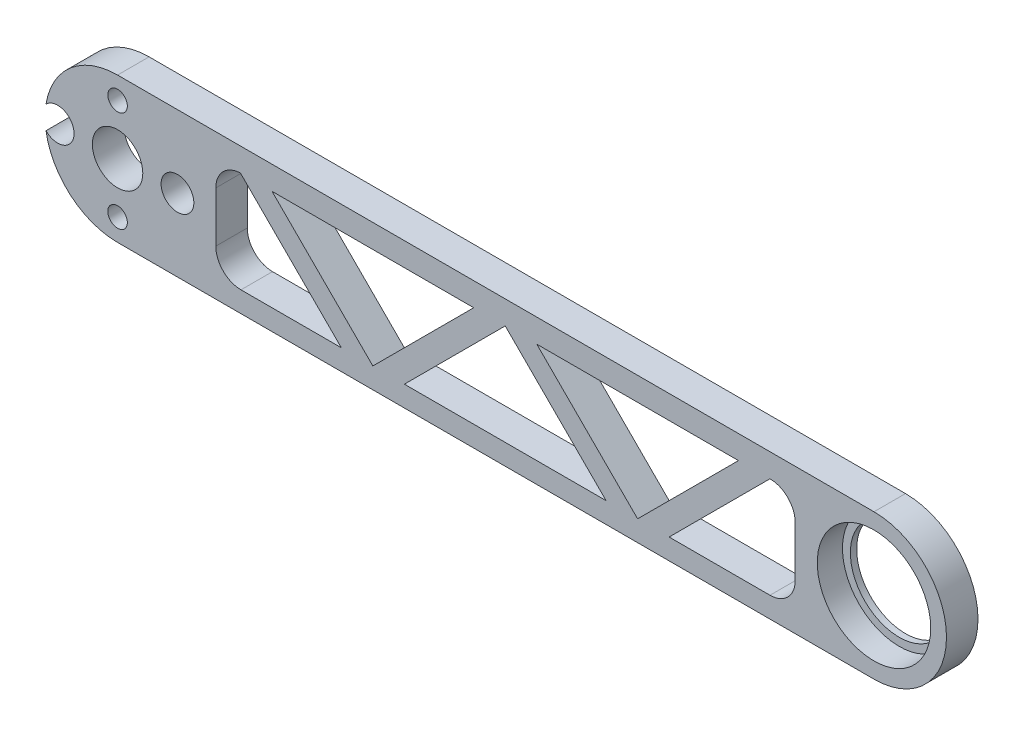
ISO-10303-21;
HEADER;
FILE_DESCRIPTION(('STEP AP214'),'2;1');
FILE_NAME('part.step','',(''),(''),'','','');
FILE_SCHEMA(('AUTOMOTIVE_DESIGN { 1 0 10303 214 1 1 1 1 }'));
ENDSEC;
DATA;
#1=APPLICATION_CONTEXT('core data for automotive mechanical design processes');
#2=APPLICATION_PROTOCOL_DEFINITION('international standard','automotive_design',2000,#1);
#3=PRODUCT_CONTEXT('',#1,'mechanical');
#4=PRODUCT('Part','Part','',(#3));
#5=PRODUCT_RELATED_PRODUCT_CATEGORY('part','',(#4));
#6=PRODUCT_DEFINITION_FORMATION('','',#4);
#7=PRODUCT_DEFINITION_CONTEXT('part definition',#1,'design');
#8=PRODUCT_DEFINITION('design','',#6,#7);
#9=PRODUCT_DEFINITION_SHAPE('','',#8);
#10=(LENGTH_UNIT() NAMED_UNIT(*) SI_UNIT(.MILLI.,.METRE.));
#11=(NAMED_UNIT(*) PLANE_ANGLE_UNIT() SI_UNIT($,.RADIAN.));
#12=(NAMED_UNIT(*) SI_UNIT($,.STERADIAN.) SOLID_ANGLE_UNIT());
#13=UNCERTAINTY_MEASURE_WITH_UNIT(LENGTH_MEASURE(1.E-05),#10,'distance_accuracy_value','');
#14=(GEOMETRIC_REPRESENTATION_CONTEXT(3) GLOBAL_UNCERTAINTY_ASSIGNED_CONTEXT((#13)) GLOBAL_UNIT_ASSIGNED_CONTEXT((#10,
#11,#12)) REPRESENTATION_CONTEXT('',''));
#15=CARTESIAN_POINT('',(0.,0.,0.));
#16=DIRECTION('',(0.,0.,1.));
#17=DIRECTION('',(1.,0.,0.));
#18=AXIS2_PLACEMENT_3D('',#15,#16,#17);
#19=CARTESIAN_POINT('',(0.,-8.22026085575622,-15.));
#20=DIRECTION('',(0.,1.,0.));
#21=DIRECTION('',(-1.,0.,0.));
#22=AXIS2_PLACEMENT_3D('',#19,#20,#21);
#23=PLANE('',#22);
#24=DIRECTION('',(-1.,0.,0.));
#25=VECTOR('',#24,1.);
#26=CARTESIAN_POINT('',(0.,-8.22026085575622,-5.));
#27=LINE('',#26,#25);
#28=CARTESIAN_POINT('',(103.5,-8.22026085575621,-5.));
#29=VERTEX_POINT('',#28);
#30=CARTESIAN_POINT('',(87.5,-8.22026085575621,-5.));
#31=VERTEX_POINT('',#30);
#32=EDGE_CURVE('E104',#29,#31,#27,.T.);
#33=ORIENTED_EDGE('',*,*,#32,.T.);
#34=DIRECTION('',(0.,0.,1.));
#35=VECTOR('',#34,1.);
#36=CARTESIAN_POINT('',(87.5,-8.22026085575621,-5.));
#37=LINE('',#36,#35);
#38=CARTESIAN_POINT('',(87.5,-8.22026085575621,0.));
#39=VERTEX_POINT('',#38);
#40=EDGE_CURVE('E109',#31,#39,#37,.T.);
#41=ORIENTED_EDGE('',*,*,#40,.T.);
#42=DIRECTION('',(-1.,0.,0.));
#43=VECTOR('',#42,1.);
#44=CARTESIAN_POINT('',(0.,-8.22026085575622,0.));
#45=LINE('',#44,#43);
#46=CARTESIAN_POINT('',(103.5,-8.22026085575621,0.));
#47=VERTEX_POINT('',#46);
#48=EDGE_CURVE('E375',#47,#39,#45,.T.);
#49=ORIENTED_EDGE('',*,*,#48,.F.);
#50=DIRECTION('',(0.,0.,1.));
#51=VECTOR('',#50,1.);
#52=CARTESIAN_POINT('',(103.5,-8.22026085575621,-15.));
#53=LINE('',#52,#51);
#54=EDGE_CURVE('E387',#29,#47,#53,.T.);
#55=ORIENTED_EDGE('',*,*,#54,.F.);
#56=EDGE_LOOP('',(#33,#41,#49,#55));
#57=FACE_BOUND('',#56,.T.);
#58=ADVANCED_FACE('F87',(#57),#23,.T.);
#59=CARTESIAN_POINT('',(77.5,-8.22026085575621,0.));
#60=VERTEX_POINT('',#59);
#61=CARTESIAN_POINT('',(45.5,-8.22026085575622,0.));
#62=VERTEX_POINT('',#61);
#63=EDGE_CURVE('E374',#60,#62,#45,.T.);
#64=ORIENTED_EDGE('',*,*,#63,.F.);
#65=DIRECTION('',(0.,0.,1.));
#66=VECTOR('',#65,1.);
#67=CARTESIAN_POINT('',(77.5,-8.22026085575621,-5.));
#68=LINE('',#67,#66);
#69=CARTESIAN_POINT('',(77.5,-8.22026085575621,-5.));
#70=VERTEX_POINT('',#69);
#71=EDGE_CURVE('E277',#70,#60,#68,.T.);
#72=ORIENTED_EDGE('',*,*,#71,.F.);
#73=CARTESIAN_POINT('',(45.5,-8.22026085575622,-5.));
#74=VERTEX_POINT('',#73);
#75=EDGE_CURVE('E395',#70,#74,#27,.T.);
#76=ORIENTED_EDGE('',*,*,#75,.T.);
#77=DIRECTION('',(0.,0.,1.));
#78=VECTOR('',#77,1.);
#79=CARTESIAN_POINT('',(45.5,-8.22026085575622,-10.));
#80=LINE('',#79,#78);
#81=EDGE_CURVE('E314',#74,#62,#80,.T.);
#82=ORIENTED_EDGE('',*,*,#81,.T.);
#83=EDGE_LOOP('',(#64,#72,#76,#82));
#84=FACE_BOUND('',#83,.T.);
#85=ADVANCED_FACE('F497',(#84),#23,.T.);
#86=CARTESIAN_POINT('',(0.,-8.,-15.));
#87=DIRECTION('',(0.,0.,1.));
#88=DIRECTION('',(1.,0.,0.));
#89=AXIS2_PLACEMENT_3D('',#86,#87,#88);
#90=CYLINDRICAL_SURFACE('',#89,1.55);
#91=CARTESIAN_POINT('',(0.,-8.,0.));
#92=DIRECTION('',(0.,0.,1.));
#93=DIRECTION('',(1.,0.,0.));
#94=AXIS2_PLACEMENT_3D('',#91,#92,#93);
#95=CIRCLE('',#94,1.55);
#96=CARTESIAN_POINT('',(1.55,-8.,0.));
#97=VERTEX_POINT('',#96);
#98=EDGE_CURVE('E429',#97,#97,#95,.T.);
#99=ORIENTED_EDGE('',*,*,#98,.T.);
#100=EDGE_LOOP('',(#99));
#101=FACE_BOUND('',#100,.T.);
#102=CARTESIAN_POINT('',(0.,-8.,-2.2));
#103=DIRECTION('',(0.,0.,-1.));
#104=DIRECTION('',(-1.,0.,0.));
#105=AXIS2_PLACEMENT_3D('',#102,#103,#104);
#106=CIRCLE('',#105,1.55);
#107=CARTESIAN_POINT('',(-1.55,-8.,-2.2));
#108=VERTEX_POINT('',#107);
#109=EDGE_CURVE('E91',#108,#108,#106,.F.);
#110=ORIENTED_EDGE('',*,*,#109,.F.);
#111=EDGE_LOOP('',(#110));
#112=FACE_BOUND('',#111,.T.);
#113=ADVANCED_FACE('F494',(#101,#112),#90,.F.);
#114=CARTESIAN_POINT('',(0.,8.,-15.));
#115=DIRECTION('',(0.,0.,1.));
#116=DIRECTION('',(1.,0.,0.));
#117=AXIS2_PLACEMENT_3D('',#114,#115,#116);
#118=CYLINDRICAL_SURFACE('',#117,1.55);
#119=CARTESIAN_POINT('',(0.,8.,0.));
#120=DIRECTION('',(0.,0.,1.));
#121=DIRECTION('',(1.,0.,0.));
#122=AXIS2_PLACEMENT_3D('',#119,#120,#121);
#123=CIRCLE('',#122,1.55);
#124=CARTESIAN_POINT('',(1.55,8.,0.));
#125=VERTEX_POINT('',#124);
#126=EDGE_CURVE('E430',#125,#125,#123,.T.);
#127=ORIENTED_EDGE('',*,*,#126,.T.);
#128=EDGE_LOOP('',(#127));
#129=FACE_BOUND('',#128,.T.);
#130=CARTESIAN_POINT('',(0.,8.,-2.2));
#131=DIRECTION('',(0.,0.,-1.));
#132=DIRECTION('',(-1.,0.,0.));
#133=AXIS2_PLACEMENT_3D('',#130,#131,#132);
#134=CIRCLE('',#133,1.55);
#135=CARTESIAN_POINT('',(-1.55,8.,-2.2));
#136=VERTEX_POINT('',#135);
#137=EDGE_CURVE('E302',#136,#136,#134,.F.);
#138=ORIENTED_EDGE('',*,*,#137,.F.);
#139=EDGE_LOOP('',(#138));
#140=FACE_BOUND('',#139,.T.);
#141=ADVANCED_FACE('F496',(#129,#140),#118,.F.);
#142=CARTESIAN_POINT('',(0.,0.,-5.));
#143=DIRECTION('',(0.,0.,1.));
#144=DIRECTION('',(1.,0.,0.));
#145=AXIS2_PLACEMENT_3D('',#142,#143,#144);
#146=PLANE('',#145);
#147=DIRECTION('',(-0.707106781186548,0.707106781186547,0.));
#148=VECTOR('',#147,1.);
#149=CARTESIAN_POINT('',(37.1398695721219,37.1398695721219,-5.));
#150=LINE('',#149,#148);
#151=CARTESIAN_POINT('',(82.5,-8.22026085575621,-5.));
#152=VERTEX_POINT('',#151);
#153=CARTESIAN_POINT('',(66.5,7.77973914424379,-5.));
#154=VERTEX_POINT('',#153);
#155=EDGE_CURVE('E293',#152,#154,#150,.T.);
#156=ORIENTED_EDGE('',*,*,#155,.F.);
#157=DIRECTION('',(-0.707106781186548,-0.707106781186548,0.));
#158=VECTOR('',#157,1.);
#159=CARTESIAN_POINT('',(45.3601304278781,-45.3601304278781,-5.));
#160=LINE('',#159,#158);
#161=CARTESIAN_POINT('',(98.5,7.77973914424379,-5.));
#162=VERTEX_POINT('',#161);
#163=EDGE_CURVE('E276',#162,#152,#160,.T.);
#164=ORIENTED_EDGE('',*,*,#163,.F.);
#165=DIRECTION('',(-1.,0.,0.));
#166=VECTOR('',#165,1.);
#167=CARTESIAN_POINT('',(0.,7.77973914424378,-5.));
#168=LINE('',#167,#166);
#169=EDGE_CURVE('E362',#162,#154,#168,.T.);
#170=ORIENTED_EDGE('',*,*,#169,.T.);
#171=EDGE_LOOP('',(#156,#164,#170));
#172=FACE_BOUND('',#171,.T.);
#173=ORIENTED_EDGE('',*,*,#75,.F.);
#174=DIRECTION('',(-0.707106781186548,0.707106781186548,0.));
#175=VECTOR('',#174,1.);
#176=CARTESIAN_POINT('',(34.6398695721219,34.6398695721219,-5.));
#177=LINE('',#176,#175);
#178=CARTESIAN_POINT('',(61.5,7.77973914424378,-5.));
#179=VERTEX_POINT('',#178);
#180=EDGE_CURVE('E266',#70,#179,#177,.T.);
#181=ORIENTED_EDGE('',*,*,#180,.T.);
#182=DIRECTION('',(-0.707106781186548,-0.707106781186548,0.));
#183=VECTOR('',#182,1.);
#184=CARTESIAN_POINT('',(26.8601304278781,-26.8601304278781,-5.));
#185=LINE('',#184,#183);
#186=EDGE_CURVE('E329',#179,#74,#185,.T.);
#187=ORIENTED_EDGE('',*,*,#186,.T.);
#188=EDGE_LOOP('',(#173,#181,#187));
#189=FACE_BOUND('',#188,.T.);
#190=CARTESIAN_POINT('',(0.,8.,-5.));
#191=DIRECTION('',(0.,0.,-1.));
#192=DIRECTION('',(-1.,0.,0.));
#193=AXIS2_PLACEMENT_3D('',#190,#191,#192);
#194=CIRCLE('',#193,2.75);
#195=CARTESIAN_POINT('',(-2.75,8.,-5.));
#196=VERTEX_POINT('',#195);
#197=EDGE_CURVE('E303',#196,#196,#194,.T.);
#198=ORIENTED_EDGE('',*,*,#197,.F.);
#199=EDGE_LOOP('',(#198));
#200=FACE_BOUND('',#199,.T.);
#201=CARTESIAN_POINT('',(0.,-8.,-5.));
#202=DIRECTION('',(0.,0.,-1.));
#203=DIRECTION('',(-1.,0.,0.));
#204=AXIS2_PLACEMENT_3D('',#201,#202,#203);
#205=CIRCLE('',#204,2.75);
#206=CARTESIAN_POINT('',(-2.75,-8.,-5.));
#207=VERTEX_POINT('',#206);
#208=EDGE_CURVE('E306',#207,#207,#205,.T.);
#209=ORIENTED_EDGE('',*,*,#208,.F.);
#210=EDGE_LOOP('',(#209));
#211=FACE_BOUND('',#210,.T.);
#212=DIRECTION('',(-0.707106781186548,0.707106781186547,0.));
#213=VECTOR('',#212,1.);
#214=CARTESIAN_POINT('',(16.1398695721219,16.1398695721219,-5.));
#215=LINE('',#214,#213);
#216=CARTESIAN_POINT('',(40.5,-8.22026085575622,-5.));
#217=VERTEX_POINT('',#216);
#218=CARTESIAN_POINT('',(24.5,7.77973914424378,-5.));
#219=VERTEX_POINT('',#218);
#220=EDGE_CURVE('E341',#217,#219,#215,.T.);
#221=ORIENTED_EDGE('',*,*,#220,.F.);
#222=DIRECTION('',(-0.707106781186548,-0.707106781186548,0.));
#223=VECTOR('',#222,1.);
#224=CARTESIAN_POINT('',(24.3601304278781,-24.3601304278781,-5.));
#225=LINE('',#224,#223);
#226=CARTESIAN_POINT('',(56.5,7.77973914424379,-5.));
#227=VERTEX_POINT('',#226);
#228=EDGE_CURVE('E336',#227,#217,#225,.T.);
#229=ORIENTED_EDGE('',*,*,#228,.F.);
#230=DIRECTION('',(-1.,0.,0.));
#231=VECTOR('',#230,1.);
#232=CARTESIAN_POINT('',(0.,7.77973914424378,-5.));
#233=LINE('',#232,#231);
#234=EDGE_CURVE('E338',#227,#219,#233,.T.);
#235=ORIENTED_EDGE('',*,*,#234,.T.);
#236=EDGE_LOOP('',(#221,#229,#235));
#237=FACE_BOUND('',#236,.T.);
#238=DIRECTION('',(-1.,0.,0.));
#239=VECTOR('',#238,1.);
#240=CARTESIAN_POINT('',(0.,-8.22026085575622,-5.));
#241=LINE('',#240,#239);
#242=CARTESIAN_POINT('',(35.5,-8.22026085575622,-5.));
#243=VERTEX_POINT('',#242);
#244=CARTESIAN_POINT('',(19.5780633118678,-8.22026085575622,-5.));
#245=VERTEX_POINT('',#244);
#246=EDGE_CURVE('E411',#243,#245,#241,.T.);
#247=ORIENTED_EDGE('',*,*,#246,.F.);
#248=DIRECTION('',(-0.707106781186548,0.707106781186547,0.));
#249=VECTOR('',#248,1.);
#250=CARTESIAN_POINT('',(13.6398695721219,13.6398695721219,-5.));
#251=LINE('',#250,#249);
#252=CARTESIAN_POINT('',(19.5,7.77973914424378,-5.));
#253=VERTEX_POINT('',#252);
#254=EDGE_CURVE('E413',#243,#253,#251,.T.);
#255=ORIENTED_EDGE('',*,*,#254,.T.);
#256=CARTESIAN_POINT('',(19.5780633118678,3.78050095187011,-5.));
#257=DIRECTION('',(0.,0.,1.));
#258=DIRECTION('',(1.,0.,0.));
#259=AXIS2_PLACEMENT_3D('',#256,#257,#258);
#260=CIRCLE('',#259,4.);
#261=CARTESIAN_POINT('',(15.5780633118678,3.78050095187011,-5.));
#262=VERTEX_POINT('',#261);
#263=EDGE_CURVE('E403',#253,#262,#260,.T.);
#264=ORIENTED_EDGE('',*,*,#263,.T.);
#265=DIRECTION('',(0.,-1.,0.));
#266=VECTOR('',#265,1.);
#267=CARTESIAN_POINT('',(15.5780633118678,0.,-5.));
#268=LINE('',#267,#266);
#269=CARTESIAN_POINT('',(15.5780633118678,-4.22026085575622,-5.));
#270=VERTEX_POINT('',#269);
#271=EDGE_CURVE('E406',#262,#270,#268,.T.);
#272=ORIENTED_EDGE('',*,*,#271,.T.);
#273=CARTESIAN_POINT('',(19.5780633118678,-4.22026085575622,-5.));
#274=DIRECTION('',(0.,0.,1.));
#275=DIRECTION('',(1.,0.,0.));
#276=AXIS2_PLACEMENT_3D('',#273,#274,#275);
#277=CIRCLE('',#276,4.);
#278=EDGE_CURVE('E409',#245,#270,#277,.F.);
#279=ORIENTED_EDGE('',*,*,#278,.F.);
#280=EDGE_LOOP('',(#247,#255,#264,#272,#279));
#281=FACE_BOUND('',#280,.T.);
#282=CARTESIAN_POINT('',(0.,0.,-5.));
#283=DIRECTION('',(0.,0.,1.));
#284=DIRECTION('',(1.,0.,0.));
#285=AXIS2_PLACEMENT_3D('',#282,#283,#284);
#286=CIRCLE('',#285,11.5);
#287=CARTESIAN_POINT('',(-11.3547368421053,-1.82207333731038,-5.));
#288=VERTEX_POINT('',#287);
#289=CARTESIAN_POINT('',(0.,-11.5,-5.));
#290=VERTEX_POINT('',#289);
#291=EDGE_CURVE('E456',#288,#290,#286,.T.);
#292=ORIENTED_EDGE('',*,*,#291,.F.);
#293=CARTESIAN_POINT('',(-9.5,0.,-5.));
#294=DIRECTION('',(0.,0.,1.));
#295=DIRECTION('',(1.,0.,0.));
#296=AXIS2_PLACEMENT_3D('',#293,#294,#295);
#297=CIRCLE('',#296,2.6);
#298=CARTESIAN_POINT('',(-11.3547368421053,1.82207333731038,-5.));
#299=VERTEX_POINT('',#298);
#300=EDGE_CURVE('E422',#288,#299,#297,.T.);
#301=ORIENTED_EDGE('',*,*,#300,.T.);
#302=CARTESIAN_POINT('',(0.,11.5,-5.));
#303=VERTEX_POINT('',#302);
#304=EDGE_CURVE('E452',#303,#299,#286,.T.);
#305=ORIENTED_EDGE('',*,*,#304,.F.);
#306=DIRECTION('',(-1.,0.,0.));
#307=VECTOR('',#306,1.);
#308=CARTESIAN_POINT('',(0.,11.5,-5.));
#309=LINE('',#308,#307);
#310=CARTESIAN_POINT('',(120.,11.5,-5.));
#311=VERTEX_POINT('',#310);
#312=EDGE_CURVE('E462',#311,#303,#309,.T.);
#313=ORIENTED_EDGE('',*,*,#312,.F.);
#314=CARTESIAN_POINT('',(120.,0.,-5.));
#315=DIRECTION('',(0.,0.,1.));
#316=DIRECTION('',(1.,0.,0.));
#317=AXIS2_PLACEMENT_3D('',#314,#315,#316);
#318=CIRCLE('',#317,11.5);
#319=CARTESIAN_POINT('',(120.,-11.5,-5.));
#320=VERTEX_POINT('',#319);
#321=EDGE_CURVE('E459',#320,#311,#318,.T.);
#322=ORIENTED_EDGE('',*,*,#321,.F.);
#323=DIRECTION('',(1.,0.,0.));
#324=VECTOR('',#323,1.);
#325=CARTESIAN_POINT('',(0.,-11.5,-5.));
#326=LINE('',#325,#324);
#327=EDGE_CURVE('E455',#290,#320,#326,.T.);
#328=ORIENTED_EDGE('',*,*,#327,.F.);
#329=EDGE_LOOP('',(#292,#301,#305,#313,#322,#328));
#330=FACE_BOUND('',#329,.T.);
#331=CARTESIAN_POINT('',(120.,0.,-5.));
#332=DIRECTION('',(0.,0.,1.));
#333=DIRECTION('',(1.,0.,0.));
#334=AXIS2_PLACEMENT_3D('',#331,#332,#333);
#335=CIRCLE('',#334,7.75);
#336=CARTESIAN_POINT('',(127.75,0.,-5.));
#337=VERTEX_POINT('',#336);
#338=EDGE_CURVE('E442',#337,#337,#335,.T.);
#339=ORIENTED_EDGE('',*,*,#338,.T.);
#340=EDGE_LOOP('',(#339));
#341=FACE_BOUND('',#340,.T.);
#342=CARTESIAN_POINT('',(0.,0.,-5.));
#343=DIRECTION('',(0.,0.,1.));
#344=DIRECTION('',(1.,0.,0.));
#345=AXIS2_PLACEMENT_3D('',#342,#343,#344);
#346=CIRCLE('',#345,4.);
#347=CARTESIAN_POINT('',(4.,0.,-5.));
#348=VERTEX_POINT('',#347);
#349=EDGE_CURVE('E438',#348,#348,#346,.T.);
#350=ORIENTED_EDGE('',*,*,#349,.T.);
#351=EDGE_LOOP('',(#350));
#352=FACE_BOUND('',#351,.T.);
#353=CARTESIAN_POINT('',(9.5,0.,-5.));
#354=DIRECTION('',(0.,0.,1.));
#355=DIRECTION('',(1.,0.,0.));
#356=AXIS2_PLACEMENT_3D('',#353,#354,#355);
#357=CIRCLE('',#356,2.6);
#358=CARTESIAN_POINT('',(12.1,0.,-5.));
#359=VERTEX_POINT('',#358);
#360=EDGE_CURVE('E419',#359,#359,#357,.T.);
#361=ORIENTED_EDGE('',*,*,#360,.T.);
#362=EDGE_LOOP('',(#361));
#363=FACE_BOUND('',#362,.T.);
#364=DIRECTION('',(-0.707106781186548,-0.707106781186547,0.));
#365=VECTOR('',#364,1.);
#366=CARTESIAN_POINT('',(47.8601304278781,-47.8601304278781,-5.));
#367=LINE('',#366,#365);
#368=CARTESIAN_POINT('',(103.5,7.77973914424379,-5.));
#369=VERTEX_POINT('',#368);
#370=EDGE_CURVE('E283',#369,#31,#367,.T.);
#371=ORIENTED_EDGE('',*,*,#370,.T.);
#372=ORIENTED_EDGE('',*,*,#32,.F.);
#373=CARTESIAN_POINT('',(103.5,-4.22026085575621,-5.));
#374=DIRECTION('',(0.,0.,1.));
#375=DIRECTION('',(1.,0.,0.));
#376=AXIS2_PLACEMENT_3D('',#373,#374,#375);
#377=CIRCLE('',#376,4.);
#378=CARTESIAN_POINT('',(107.5,-4.22026085575621,-5.));
#379=VERTEX_POINT('',#378);
#380=EDGE_CURVE('E397',#379,#29,#377,.F.);
#381=ORIENTED_EDGE('',*,*,#380,.F.);
#382=DIRECTION('',(0.,-1.,0.));
#383=VECTOR('',#382,1.);
#384=CARTESIAN_POINT('',(107.5,0.,-5.));
#385=LINE('',#384,#383);
#386=CARTESIAN_POINT('',(107.5,3.77973914424379,-5.));
#387=VERTEX_POINT('',#386);
#388=EDGE_CURVE('E399',#387,#379,#385,.T.);
#389=ORIENTED_EDGE('',*,*,#388,.F.);
#390=CARTESIAN_POINT('',(103.5,3.77973914424379,-5.));
#391=DIRECTION('',(0.,0.,1.));
#392=DIRECTION('',(1.,0.,0.));
#393=AXIS2_PLACEMENT_3D('',#390,#391,#392);
#394=CIRCLE('',#393,4.);
#395=EDGE_CURVE('E401',#369,#387,#394,.F.);
#396=ORIENTED_EDGE('',*,*,#395,.F.);
#397=EDGE_LOOP('',(#371,#372,#381,#389,#396));
#398=FACE_BOUND('',#397,.T.);
#399=ADVANCED_FACE('F504',(#172,#189,#200,#211,#237,#281,#330,#341,#352,#363,#398),#146,.F.);
#400=CARTESIAN_POINT('',(0.,0.,0.));
#401=DIRECTION('',(0.,0.,1.));
#402=DIRECTION('',(1.,0.,0.));
#403=AXIS2_PLACEMENT_3D('',#400,#401,#402);
#404=PLANE('',#403);
#405=DIRECTION('',(-0.707106781186548,-0.707106781186548,0.));
#406=VECTOR('',#405,1.);
#407=CARTESIAN_POINT('',(45.3601304278781,-45.3601304278781,0.));
#408=LINE('',#407,#406);
#409=CARTESIAN_POINT('',(98.5,7.77973914424379,0.));
#410=VERTEX_POINT('',#409);
#411=CARTESIAN_POINT('',(82.5,-8.22026085575621,0.));
#412=VERTEX_POINT('',#411);
#413=EDGE_CURVE('E274',#410,#412,#408,.T.);
#414=ORIENTED_EDGE('',*,*,#413,.T.);
#415=DIRECTION('',(-0.707106781186548,0.707106781186547,0.));
#416=VECTOR('',#415,1.);
#417=CARTESIAN_POINT('',(37.1398695721219,37.1398695721219,0.));
#418=LINE('',#417,#416);
#419=CARTESIAN_POINT('',(66.5,7.77973914424379,0.));
#420=VERTEX_POINT('',#419);
#421=EDGE_CURVE('E256',#412,#420,#418,.T.);
#422=ORIENTED_EDGE('',*,*,#421,.T.);
#423=DIRECTION('',(-1.,0.,0.));
#424=VECTOR('',#423,1.);
#425=CARTESIAN_POINT('',(0.,7.77973914424378,0.));
#426=LINE('',#425,#424);
#427=EDGE_CURVE('E281',#410,#420,#426,.T.);
#428=ORIENTED_EDGE('',*,*,#427,.F.);
#429=EDGE_LOOP('',(#414,#422,#428));
#430=FACE_BOUND('',#429,.T.);
#431=DIRECTION('',(-0.707106781186548,0.707106781186548,0.));
#432=VECTOR('',#431,1.);
#433=CARTESIAN_POINT('',(34.6398695721219,34.6398695721219,0.));
#434=LINE('',#433,#432);
#435=CARTESIAN_POINT('',(61.5,7.77973914424378,0.));
#436=VERTEX_POINT('',#435);
#437=EDGE_CURVE('E267',#60,#436,#434,.T.);
#438=ORIENTED_EDGE('',*,*,#437,.F.);
#439=ORIENTED_EDGE('',*,*,#63,.T.);
#440=DIRECTION('',(-0.707106781186548,-0.707106781186548,0.));
#441=VECTOR('',#440,1.);
#442=CARTESIAN_POINT('',(26.8601304278781,-26.8601304278781,0.));
#443=LINE('',#442,#441);
#444=EDGE_CURVE('E311',#436,#62,#443,.T.);
#445=ORIENTED_EDGE('',*,*,#444,.F.);
#446=EDGE_LOOP('',(#438,#439,#445));
#447=FACE_BOUND('',#446,.T.);
#448=DIRECTION('',(-0.707106781186548,0.707106781186547,0.));
#449=VECTOR('',#448,1.);
#450=CARTESIAN_POINT('',(13.6398695721219,13.6398695721219,0.));
#451=LINE('',#450,#449);
#452=CARTESIAN_POINT('',(35.5,-8.22026085575622,0.));
#453=VERTEX_POINT('',#452);
#454=CARTESIAN_POINT('',(19.5,7.77973914424378,0.));
#455=VERTEX_POINT('',#454);
#456=EDGE_CURVE('E344',#453,#455,#451,.T.);
#457=ORIENTED_EDGE('',*,*,#456,.F.);
#458=DIRECTION('',(-1.,0.,0.));
#459=VECTOR('',#458,1.);
#460=CARTESIAN_POINT('',(0.,-8.22026085575622,0.));
#461=LINE('',#460,#459);
#462=CARTESIAN_POINT('',(19.5780633118678,-8.22026085575622,0.));
#463=VERTEX_POINT('',#462);
#464=EDGE_CURVE('E356',#453,#463,#461,.T.);
#465=ORIENTED_EDGE('',*,*,#464,.T.);
#466=CARTESIAN_POINT('',(19.5780633118678,-4.22026085575622,0.));
#467=DIRECTION('',(0.,0.,1.));
#468=DIRECTION('',(1.,0.,0.));
#469=AXIS2_PLACEMENT_3D('',#466,#467,#468);
#470=CIRCLE('',#469,4.);
#471=CARTESIAN_POINT('',(15.5780633118678,-4.22026085575622,0.));
#472=VERTEX_POINT('',#471);
#473=EDGE_CURVE('E353',#463,#472,#470,.F.);
#474=ORIENTED_EDGE('',*,*,#473,.T.);
#475=DIRECTION('',(0.,-1.,0.));
#476=VECTOR('',#475,1.);
#477=CARTESIAN_POINT('',(15.5780633118678,0.,0.));
#478=LINE('',#477,#476);
#479=CARTESIAN_POINT('',(15.5780633118678,3.78050095187011,0.));
#480=VERTEX_POINT('',#479);
#481=EDGE_CURVE('E350',#480,#472,#478,.T.);
#482=ORIENTED_EDGE('',*,*,#481,.F.);
#483=CARTESIAN_POINT('',(19.5780633118678,3.78050095187011,0.));
#484=DIRECTION('',(0.,0.,1.));
#485=DIRECTION('',(1.,0.,0.));
#486=AXIS2_PLACEMENT_3D('',#483,#484,#485);
#487=CIRCLE('',#486,4.);
#488=EDGE_CURVE('E346',#455,#480,#487,.T.);
#489=ORIENTED_EDGE('',*,*,#488,.F.);
#490=EDGE_LOOP('',(#457,#465,#474,#482,#489));
#491=FACE_BOUND('',#490,.T.);
#492=CARTESIAN_POINT('',(-9.5,0.,0.));
#493=DIRECTION('',(0.,0.,1.));
#494=DIRECTION('',(1.,0.,0.));
#495=AXIS2_PLACEMENT_3D('',#492,#493,#494);
#496=CIRCLE('',#495,2.6);
#497=CARTESIAN_POINT('',(-11.3547368421053,-1.82207333731038,0.));
#498=VERTEX_POINT('',#497);
#499=CARTESIAN_POINT('',(-11.3547368421053,1.82207333731038,0.));
#500=VERTEX_POINT('',#499);
#501=EDGE_CURVE('E12',#498,#500,#496,.T.);
#502=ORIENTED_EDGE('',*,*,#501,.F.);
#503=CARTESIAN_POINT('',(0.,0.,0.));
#504=DIRECTION('',(0.,0.,1.));
#505=DIRECTION('',(1.,0.,0.));
#506=AXIS2_PLACEMENT_3D('',#503,#504,#505);
#507=CIRCLE('',#506,11.5);
#508=CARTESIAN_POINT('',(0.,-11.5,0.));
#509=VERTEX_POINT('',#508);
#510=EDGE_CURVE('E449',#498,#509,#507,.T.);
#511=ORIENTED_EDGE('',*,*,#510,.T.);
#512=DIRECTION('',(1.,0.,0.));
#513=VECTOR('',#512,1.);
#514=CARTESIAN_POINT('',(0.,-11.5,0.));
#515=LINE('',#514,#513);
#516=CARTESIAN_POINT('',(120.,-11.5,0.));
#517=VERTEX_POINT('',#516);
#518=EDGE_CURVE('E469',#509,#517,#515,.T.);
#519=ORIENTED_EDGE('',*,*,#518,.T.);
#520=CARTESIAN_POINT('',(120.,0.,0.));
#521=DIRECTION('',(0.,0.,1.));
#522=DIRECTION('',(1.,0.,0.));
#523=AXIS2_PLACEMENT_3D('',#520,#521,#522);
#524=CIRCLE('',#523,11.5);
#525=CARTESIAN_POINT('',(120.,11.5,0.));
#526=VERTEX_POINT('',#525);
#527=EDGE_CURVE('E472',#517,#526,#524,.T.);
#528=ORIENTED_EDGE('',*,*,#527,.T.);
#529=DIRECTION('',(-1.,0.,0.));
#530=VECTOR('',#529,1.);
#531=CARTESIAN_POINT('',(0.,11.5,0.));
#532=LINE('',#531,#530);
#533=CARTESIAN_POINT('',(0.,11.5,0.));
#534=VERTEX_POINT('',#533);
#535=EDGE_CURVE('E475',#526,#534,#532,.T.);
#536=ORIENTED_EDGE('',*,*,#535,.T.);
#537=EDGE_CURVE('E466',#534,#500,#507,.T.);
#538=ORIENTED_EDGE('',*,*,#537,.T.);
#539=EDGE_LOOP('',(#502,#511,#519,#528,#536,#538));
#540=FACE_BOUND('',#539,.T.);
#541=CARTESIAN_POINT('',(9.5,0.,0.));
#542=DIRECTION('',(0.,0.,1.));
#543=DIRECTION('',(1.,0.,0.));
#544=AXIS2_PLACEMENT_3D('',#541,#542,#543);
#545=CIRCLE('',#544,2.6);
#546=CARTESIAN_POINT('',(12.1,0.,0.));
#547=VERTEX_POINT('',#546);
#548=EDGE_CURVE('E416',#547,#547,#545,.T.);
#549=ORIENTED_EDGE('',*,*,#548,.F.);
#550=EDGE_LOOP('',(#549));
#551=FACE_BOUND('',#550,.T.);
#552=ORIENTED_EDGE('',*,*,#126,.F.);
#553=EDGE_LOOP('',(#552));
#554=FACE_BOUND('',#553,.T.);
#555=ORIENTED_EDGE('',*,*,#98,.F.);
#556=EDGE_LOOP('',(#555));
#557=FACE_BOUND('',#556,.T.);
#558=CARTESIAN_POINT('',(0.,0.,0.));
#559=DIRECTION('',(0.,0.,1.));
#560=DIRECTION('',(1.,0.,0.));
#561=AXIS2_PLACEMENT_3D('',#558,#559,#560);
#562=CIRCLE('',#561,4.);
#563=CARTESIAN_POINT('',(4.,0.,0.));
#564=VERTEX_POINT('',#563);
#565=EDGE_CURVE('E433',#564,#564,#562,.T.);
#566=ORIENTED_EDGE('',*,*,#565,.F.);
#567=EDGE_LOOP('',(#566));
#568=FACE_BOUND('',#567,.T.);
#569=CARTESIAN_POINT('',(120.,0.,0.));
#570=DIRECTION('',(0.,0.,1.));
#571=DIRECTION('',(1.,0.,0.));
#572=AXIS2_PLACEMENT_3D('',#569,#570,#571);
#573=CIRCLE('',#572,9.00000000000001);
#574=CARTESIAN_POINT('',(129.,0.,0.));
#575=VERTEX_POINT('',#574);
#576=EDGE_CURVE('E445',#575,#575,#573,.T.);
#577=ORIENTED_EDGE('',*,*,#576,.F.);
#578=EDGE_LOOP('',(#577));
#579=FACE_BOUND('',#578,.T.);
#580=DIRECTION('',(-0.707106781186548,-0.707106781186548,0.));
#581=VECTOR('',#580,1.);
#582=CARTESIAN_POINT('',(24.3601304278781,-24.3601304278781,0.));
#583=LINE('',#582,#581);
#584=CARTESIAN_POINT('',(56.5,7.77973914424379,0.));
#585=VERTEX_POINT('',#584);
#586=CARTESIAN_POINT('',(40.5,-8.22026085575622,0.));
#587=VERTEX_POINT('',#586);
#588=EDGE_CURVE('E320',#585,#587,#583,.T.);
#589=ORIENTED_EDGE('',*,*,#588,.T.);
#590=DIRECTION('',(-0.707106781186548,0.707106781186547,0.));
#591=VECTOR('',#590,1.);
#592=CARTESIAN_POINT('',(16.1398695721219,16.1398695721219,0.));
#593=LINE('',#592,#591);
#594=CARTESIAN_POINT('',(24.5,7.77973914424378,0.));
#595=VERTEX_POINT('',#594);
#596=EDGE_CURVE('E317',#587,#595,#593,.T.);
#597=ORIENTED_EDGE('',*,*,#596,.T.);
#598=DIRECTION('',(-1.,0.,0.));
#599=VECTOR('',#598,1.);
#600=CARTESIAN_POINT('',(0.,7.77973914424378,0.));
#601=LINE('',#600,#599);
#602=EDGE_CURVE('E323',#585,#595,#601,.T.);
#603=ORIENTED_EDGE('',*,*,#602,.F.);
#604=EDGE_LOOP('',(#589,#597,#603));
#605=FACE_BOUND('',#604,.T.);
#606=ORIENTED_EDGE('',*,*,#48,.T.);
#607=DIRECTION('',(-0.707106781186548,-0.707106781186547,0.));
#608=VECTOR('',#607,1.);
#609=CARTESIAN_POINT('',(47.8601304278781,-47.8601304278781,0.));
#610=LINE('',#609,#608);
#611=CARTESIAN_POINT('',(103.5,7.77973914424379,0.));
#612=VERTEX_POINT('',#611);
#613=EDGE_CURVE('E288',#612,#39,#610,.T.);
#614=ORIENTED_EDGE('',*,*,#613,.F.);
#615=CARTESIAN_POINT('',(103.5,3.77973914424379,0.));
#616=DIRECTION('',(0.,0.,1.));
#617=DIRECTION('',(1.,0.,0.));
#618=AXIS2_PLACEMENT_3D('',#615,#616,#617);
#619=CIRCLE('',#618,4.);
#620=CARTESIAN_POINT('',(107.5,3.77973914424379,0.));
#621=VERTEX_POINT('',#620);
#622=EDGE_CURVE('E343',#612,#621,#619,.F.);
#623=ORIENTED_EDGE('',*,*,#622,.T.);
#624=DIRECTION('',(0.,-1.,0.));
#625=VECTOR('',#624,1.);
#626=CARTESIAN_POINT('',(107.5,0.,0.));
#627=LINE('',#626,#625);
#628=CARTESIAN_POINT('',(107.5,-4.22026085575621,0.));
#629=VERTEX_POINT('',#628);
#630=EDGE_CURVE('E380',#621,#629,#627,.T.);
#631=ORIENTED_EDGE('',*,*,#630,.T.);
#632=CARTESIAN_POINT('',(103.5,-4.22026085575621,0.));
#633=DIRECTION('',(0.,0.,1.));
#634=DIRECTION('',(1.,0.,0.));
#635=AXIS2_PLACEMENT_3D('',#632,#633,#634);
#636=CIRCLE('',#635,4.);
#637=EDGE_CURVE('E377',#629,#47,#636,.F.);
#638=ORIENTED_EDGE('',*,*,#637,.T.);
#639=EDGE_LOOP('',(#606,#614,#623,#631,#638));
#640=FACE_BOUND('',#639,.T.);
#641=ADVANCED_FACE('F279',(#430,#447,#491,#540,#551,#554,#557,#568,#579,#605,#640),#404,.T.);
#642=CARTESIAN_POINT('',(0.,0.,-5.));
#643=DIRECTION('',(0.,0.,1.));
#644=DIRECTION('',(1.,0.,0.));
#645=AXIS2_PLACEMENT_3D('',#642,#643,#644);
#646=CYLINDRICAL_SURFACE('',#645,11.5);
#647=DIRECTION('',(0.,0.,1.));
#648=VECTOR('',#647,1.);
#649=CARTESIAN_POINT('',(-11.3547368421053,-1.82207333731038,-7.5));
#650=LINE('',#649,#648);
#651=EDGE_CURVE('E427',#288,#498,#650,.T.);
#652=ORIENTED_EDGE('',*,*,#651,.F.);
#653=ORIENTED_EDGE('',*,*,#291,.T.);
#654=DIRECTION('',(0.,0.,1.));
#655=VECTOR('',#654,1.);
#656=CARTESIAN_POINT('',(0.,-11.5,-5.));
#657=LINE('',#656,#655);
#658=EDGE_CURVE('E465',#290,#509,#657,.T.);
#659=ORIENTED_EDGE('',*,*,#658,.T.);
#660=ORIENTED_EDGE('',*,*,#510,.F.);
#661=EDGE_LOOP('',(#652,#653,#659,#660));
#662=FACE_BOUND('',#661,.T.);
#663=ADVANCED_FACE('F599',(#662),#646,.T.);
#664=DIRECTION('',(0.,0.,1.));
#665=VECTOR('',#664,1.);
#666=CARTESIAN_POINT('',(-11.3547368421053,1.82207333731038,-7.5));
#667=LINE('',#666,#665);
#668=EDGE_CURVE('E425',#500,#299,#667,.F.);
#669=ORIENTED_EDGE('',*,*,#668,.F.);
#670=ORIENTED_EDGE('',*,*,#537,.F.);
#671=DIRECTION('',(0.,0.,1.));
#672=VECTOR('',#671,1.);
#673=CARTESIAN_POINT('',(0.,11.5,-5.));
#674=LINE('',#673,#672);
#675=EDGE_CURVE('E96',#303,#534,#674,.T.);
#676=ORIENTED_EDGE('',*,*,#675,.F.);
#677=ORIENTED_EDGE('',*,*,#304,.T.);
#678=EDGE_LOOP('',(#669,#670,#676,#677));
#679=FACE_BOUND('',#678,.T.);
#680=ADVANCED_FACE('F89',(#679),#646,.T.);
#681=CARTESIAN_POINT('',(0.,11.5,-5.));
#682=DIRECTION('',(0.,1.,0.));
#683=DIRECTION('',(0.,0.,1.));
#684=AXIS2_PLACEMENT_3D('',#681,#682,#683);
#685=PLANE('',#684);
#686=ORIENTED_EDGE('',*,*,#535,.F.);
#687=DIRECTION('',(0.,0.,1.));
#688=VECTOR('',#687,1.);
#689=CARTESIAN_POINT('',(120.,11.5,-5.));
#690=LINE('',#689,#688);
#691=EDGE_CURVE('E479',#311,#526,#690,.T.);
#692=ORIENTED_EDGE('',*,*,#691,.F.);
#693=ORIENTED_EDGE('',*,*,#312,.T.);
#694=ORIENTED_EDGE('',*,*,#675,.T.);
#695=EDGE_LOOP('',(#686,#692,#693,#694));
#696=FACE_BOUND('',#695,.T.);
#697=ADVANCED_FACE('F600',(#696),#685,.T.);
#698=CARTESIAN_POINT('',(120.,0.,-5.));
#699=DIRECTION('',(0.,0.,1.));
#700=DIRECTION('',(1.,0.,0.));
#701=AXIS2_PLACEMENT_3D('',#698,#699,#700);
#702=CYLINDRICAL_SURFACE('',#701,11.5);
#703=ORIENTED_EDGE('',*,*,#527,.F.);
#704=DIRECTION('',(0.,0.,1.));
#705=VECTOR('',#704,1.);
#706=CARTESIAN_POINT('',(120.,-11.5,-5.));
#707=LINE('',#706,#705);
#708=EDGE_CURVE('E481',#320,#517,#707,.T.);
#709=ORIENTED_EDGE('',*,*,#708,.F.);
#710=ORIENTED_EDGE('',*,*,#321,.T.);
#711=ORIENTED_EDGE('',*,*,#691,.T.);
#712=EDGE_LOOP('',(#703,#709,#710,#711));
#713=FACE_BOUND('',#712,.T.);
#714=ADVANCED_FACE('F603',(#713),#702,.T.);
#715=CARTESIAN_POINT('',(0.,-11.5,-5.));
#716=DIRECTION('',(0.,-1.,0.));
#717=DIRECTION('',(0.,0.,-1.));
#718=AXIS2_PLACEMENT_3D('',#715,#716,#717);
#719=PLANE('',#718);
#720=ORIENTED_EDGE('',*,*,#518,.F.);
#721=ORIENTED_EDGE('',*,*,#658,.F.);
#722=ORIENTED_EDGE('',*,*,#327,.T.);
#723=ORIENTED_EDGE('',*,*,#708,.T.);
#724=EDGE_LOOP('',(#720,#721,#722,#723));
#725=FACE_BOUND('',#724,.T.);
#726=ADVANCED_FACE('F594',(#725),#719,.T.);
#727=CARTESIAN_POINT('',(120.,0.,-4.));
#728=DIRECTION('',(0.,0.,1.));
#729=DIRECTION('',(1.,0.,0.));
#730=AXIS2_PLACEMENT_3D('',#727,#728,#729);
#731=CYLINDRICAL_SURFACE('',#730,9.00000000000001);
#732=CARTESIAN_POINT('',(120.,0.,-4.));
#733=DIRECTION('',(0.,0.,1.));
#734=DIRECTION('',(1.,0.,0.));
#735=AXIS2_PLACEMENT_3D('',#732,#733,#734);
#736=CIRCLE('',#735,9.00000000000001);
#737=CARTESIAN_POINT('',(129.,0.,-4.));
#738=VERTEX_POINT('',#737);
#739=EDGE_CURVE('E446',#738,#738,#736,.T.);
#740=ORIENTED_EDGE('',*,*,#739,.F.);
#741=EDGE_LOOP('',(#740));
#742=FACE_BOUND('',#741,.T.);
#743=ORIENTED_EDGE('',*,*,#576,.T.);
#744=EDGE_LOOP('',(#743));
#745=FACE_BOUND('',#744,.T.);
#746=ADVANCED_FACE('F589',(#742,#745),#731,.F.);
#747=CARTESIAN_POINT('',(120.,0.,-4.));
#748=DIRECTION('',(0.,0.,1.));
#749=DIRECTION('',(1.,0.,0.));
#750=AXIS2_PLACEMENT_3D('',#747,#748,#749);
#751=PLANE('',#750);
#752=CARTESIAN_POINT('',(120.,0.,-4.));
#753=DIRECTION('',(0.,0.,1.));
#754=DIRECTION('',(1.,0.,0.));
#755=AXIS2_PLACEMENT_3D('',#752,#753,#754);
#756=CIRCLE('',#755,7.75);
#757=CARTESIAN_POINT('',(127.75,0.,-4.));
#758=VERTEX_POINT('',#757);
#759=EDGE_CURVE('E441',#758,#758,#756,.T.);
#760=ORIENTED_EDGE('',*,*,#759,.F.);
#761=EDGE_LOOP('',(#760));
#762=FACE_BOUND('',#761,.T.);
#763=ORIENTED_EDGE('',*,*,#739,.T.);
#764=EDGE_LOOP('',(#763));
#765=FACE_BOUND('',#764,.T.);
#766=ADVANCED_FACE('F583',(#762,#765),#751,.T.);
#767=CARTESIAN_POINT('',(120.,0.,-15.));
#768=DIRECTION('',(0.,0.,1.));
#769=DIRECTION('',(1.,0.,0.));
#770=AXIS2_PLACEMENT_3D('',#767,#768,#769);
#771=CYLINDRICAL_SURFACE('',#770,7.75);
#772=ORIENTED_EDGE('',*,*,#759,.T.);
#773=EDGE_LOOP('',(#772));
#774=FACE_BOUND('',#773,.T.);
#775=ORIENTED_EDGE('',*,*,#338,.F.);
#776=EDGE_LOOP('',(#775));
#777=FACE_BOUND('',#776,.T.);
#778=ADVANCED_FACE('F541',(#774,#777),#771,.F.);
#779=CARTESIAN_POINT('',(0.,0.,-15.));
#780=DIRECTION('',(0.,0.,1.));
#781=DIRECTION('',(1.,0.,0.));
#782=AXIS2_PLACEMENT_3D('',#779,#780,#781);
#783=CYLINDRICAL_SURFACE('',#782,4.);
#784=ORIENTED_EDGE('',*,*,#565,.T.);
#785=EDGE_LOOP('',(#784));
#786=FACE_BOUND('',#785,.T.);
#787=ORIENTED_EDGE('',*,*,#349,.F.);
#788=EDGE_LOOP('',(#787));
#789=FACE_BOUND('',#788,.T.);
#790=ADVANCED_FACE('F535',(#786,#789),#783,.F.);
#791=CARTESIAN_POINT('',(9.5,0.,-15.));
#792=DIRECTION('',(0.,0.,1.));
#793=DIRECTION('',(1.,0.,0.));
#794=AXIS2_PLACEMENT_3D('',#791,#792,#793);
#795=CYLINDRICAL_SURFACE('',#794,2.6);
#796=ORIENTED_EDGE('',*,*,#548,.T.);
#797=EDGE_LOOP('',(#796));
#798=FACE_BOUND('',#797,.T.);
#799=ORIENTED_EDGE('',*,*,#360,.F.);
#800=EDGE_LOOP('',(#799));
#801=FACE_BOUND('',#800,.T.);
#802=ADVANCED_FACE('F532',(#798,#801),#795,.F.);
#803=CARTESIAN_POINT('',(-9.5,0.,-15.));
#804=DIRECTION('',(0.,0.,1.));
#805=DIRECTION('',(1.,0.,0.));
#806=AXIS2_PLACEMENT_3D('',#803,#804,#805);
#807=CYLINDRICAL_SURFACE('',#806,2.6);
#808=ORIENTED_EDGE('',*,*,#651,.T.);
#809=ORIENTED_EDGE('',*,*,#501,.T.);
#810=ORIENTED_EDGE('',*,*,#668,.T.);
#811=ORIENTED_EDGE('',*,*,#300,.F.);
#812=EDGE_LOOP('',(#808,#809,#810,#811));
#813=FACE_BOUND('',#812,.T.);
#814=ADVANCED_FACE('F528',(#813),#807,.F.);
#815=CARTESIAN_POINT('',(103.5,3.77973914424379,-15.));
#816=DIRECTION('',(0.,0.,1.));
#817=DIRECTION('',(1.,0.,0.));
#818=AXIS2_PLACEMENT_3D('',#815,#816,#817);
#819=CYLINDRICAL_SURFACE('',#818,4.);
#820=ORIENTED_EDGE('',*,*,#395,.T.);
#821=DIRECTION('',(0.,0.,1.));
#822=VECTOR('',#821,1.);
#823=CARTESIAN_POINT('',(107.5,3.77973914424379,-15.));
#824=LINE('',#823,#822);
#825=EDGE_CURVE('E347',#387,#621,#824,.T.);
#826=ORIENTED_EDGE('',*,*,#825,.T.);
#827=ORIENTED_EDGE('',*,*,#622,.F.);
#828=DIRECTION('',(0.,0.,1.));
#829=VECTOR('',#828,1.);
#830=CARTESIAN_POINT('',(103.5,7.77973914424379,-15.));
#831=LINE('',#830,#829);
#832=EDGE_CURVE('E383',#369,#612,#831,.T.);
#833=ORIENTED_EDGE('',*,*,#832,.F.);
#834=EDGE_LOOP('',(#820,#826,#827,#833));
#835=FACE_BOUND('',#834,.T.);
#836=ADVANCED_FACE('F524',(#835),#819,.F.);
#837=CARTESIAN_POINT('',(107.5,0.,-15.));
#838=DIRECTION('',(-1.,0.,0.));
#839=DIRECTION('',(0.,0.,1.));
#840=AXIS2_PLACEMENT_3D('',#837,#838,#839);
#841=PLANE('',#840);
#842=ORIENTED_EDGE('',*,*,#388,.T.);
#843=DIRECTION('',(0.,0.,1.));
#844=VECTOR('',#843,1.);
#845=CARTESIAN_POINT('',(107.5,-4.22026085575621,-15.));
#846=LINE('',#845,#844);
#847=EDGE_CURVE('E385',#379,#629,#846,.T.);
#848=ORIENTED_EDGE('',*,*,#847,.T.);
#849=ORIENTED_EDGE('',*,*,#630,.F.);
#850=ORIENTED_EDGE('',*,*,#825,.F.);
#851=EDGE_LOOP('',(#842,#848,#849,#850));
#852=FACE_BOUND('',#851,.T.);
#853=ADVANCED_FACE('F527',(#852),#841,.T.);
#854=CARTESIAN_POINT('',(103.5,-4.22026085575621,-15.));
#855=DIRECTION('',(0.,0.,1.));
#856=DIRECTION('',(1.,0.,0.));
#857=AXIS2_PLACEMENT_3D('',#854,#855,#856);
#858=CYLINDRICAL_SURFACE('',#857,4.);
#859=ORIENTED_EDGE('',*,*,#380,.T.);
#860=ORIENTED_EDGE('',*,*,#54,.T.);
#861=ORIENTED_EDGE('',*,*,#637,.F.);
#862=ORIENTED_EDGE('',*,*,#847,.F.);
#863=EDGE_LOOP('',(#859,#860,#861,#862));
#864=FACE_BOUND('',#863,.T.);
#865=ADVANCED_FACE('F517',(#864),#858,.F.);
#866=CARTESIAN_POINT('',(0.,7.77973914424378,-15.));
#867=DIRECTION('',(0.,1.,0.));
#868=DIRECTION('',(-1.,0.,0.));
#869=AXIS2_PLACEMENT_3D('',#866,#867,#868);
#870=PLANE('',#869);
#871=ORIENTED_EDGE('',*,*,#169,.F.);
#872=DIRECTION('',(0.,0.,1.));
#873=VECTOR('',#872,1.);
#874=CARTESIAN_POINT('',(98.5,7.77973914424379,-5.));
#875=LINE('',#874,#873);
#876=EDGE_CURVE('E559',#162,#410,#875,.T.);
#877=ORIENTED_EDGE('',*,*,#876,.T.);
#878=ORIENTED_EDGE('',*,*,#427,.T.);
#879=DIRECTION('',(0.,0.,1.));
#880=VECTOR('',#879,1.);
#881=CARTESIAN_POINT('',(66.5,7.77973914424379,-5.));
#882=LINE('',#881,#880);
#883=EDGE_CURVE('E263',#154,#420,#882,.T.);
#884=ORIENTED_EDGE('',*,*,#883,.F.);
#885=EDGE_LOOP('',(#871,#877,#878,#884));
#886=FACE_BOUND('',#885,.T.);
#887=ADVANCED_FACE('F519',(#886),#870,.F.);
#888=CARTESIAN_POINT('',(13.6398695721219,13.6398695721219,-15.));
#889=DIRECTION('',(0.707106781186547,0.707106781186548,0.));
#890=DIRECTION('',(-0.707106781186548,0.707106781186547,0.));
#891=AXIS2_PLACEMENT_3D('',#888,#889,#890);
#892=PLANE('',#891);
#893=DIRECTION('',(0.,0.,1.));
#894=VECTOR('',#893,1.);
#895=CARTESIAN_POINT('',(35.5,-8.22026085575622,-15.));
#896=LINE('',#895,#894);
#897=EDGE_CURVE('E360',#243,#453,#896,.T.);
#898=ORIENTED_EDGE('',*,*,#897,.T.);
#899=ORIENTED_EDGE('',*,*,#456,.T.);
#900=DIRECTION('',(0.,0.,1.));
#901=VECTOR('',#900,1.);
#902=CARTESIAN_POINT('',(19.5,7.77973914424378,-15.));
#903=LINE('',#902,#901);
#904=EDGE_CURVE('E359',#253,#455,#903,.T.);
#905=ORIENTED_EDGE('',*,*,#904,.F.);
#906=ORIENTED_EDGE('',*,*,#254,.F.);
#907=EDGE_LOOP('',(#898,#899,#905,#906));
#908=FACE_BOUND('',#907,.T.);
#909=ADVANCED_FACE('F522',(#908),#892,.F.);
#910=CARTESIAN_POINT('',(0.,-8.22026085575622,-15.));
#911=DIRECTION('',(0.,1.,0.));
#912=DIRECTION('',(-1.,0.,0.));
#913=AXIS2_PLACEMENT_3D('',#910,#911,#912);
#914=PLANE('',#913);
#915=ORIENTED_EDGE('',*,*,#246,.T.);
#916=DIRECTION('',(0.,0.,1.));
#917=VECTOR('',#916,1.);
#918=CARTESIAN_POINT('',(19.5780633118678,-8.22026085575622,-15.));
#919=LINE('',#918,#917);
#920=EDGE_CURVE('E363',#245,#463,#919,.T.);
#921=ORIENTED_EDGE('',*,*,#920,.T.);
#922=ORIENTED_EDGE('',*,*,#464,.F.);
#923=ORIENTED_EDGE('',*,*,#897,.F.);
#924=EDGE_LOOP('',(#915,#921,#922,#923));
#925=FACE_BOUND('',#924,.T.);
#926=ADVANCED_FACE('F697',(#925),#914,.T.);
#927=CARTESIAN_POINT('',(19.5780633118678,-4.22026085575622,-15.));
#928=DIRECTION('',(0.,0.,1.));
#929=DIRECTION('',(1.,0.,0.));
#930=AXIS2_PLACEMENT_3D('',#927,#928,#929);
#931=CYLINDRICAL_SURFACE('',#930,4.);
#932=ORIENTED_EDGE('',*,*,#278,.T.);
#933=DIRECTION('',(0.,0.,1.));
#934=VECTOR('',#933,1.);
#935=CARTESIAN_POINT('',(15.5780633118678,-4.22026085575622,-15.));
#936=LINE('',#935,#934);
#937=EDGE_CURVE('E365',#270,#472,#936,.T.);
#938=ORIENTED_EDGE('',*,*,#937,.T.);
#939=ORIENTED_EDGE('',*,*,#473,.F.);
#940=ORIENTED_EDGE('',*,*,#920,.F.);
#941=EDGE_LOOP('',(#932,#938,#939,#940));
#942=FACE_BOUND('',#941,.T.);
#943=ADVANCED_FACE('F707',(#942),#931,.F.);
#944=CARTESIAN_POINT('',(15.5780633118678,0.,-15.));
#945=DIRECTION('',(-1.,0.,0.));
#946=DIRECTION('',(0.,-1.,0.));
#947=AXIS2_PLACEMENT_3D('',#944,#945,#946);
#948=PLANE('',#947);
#949=DIRECTION('',(0.,0.,1.));
#950=VECTOR('',#949,1.);
#951=CARTESIAN_POINT('',(15.5780633118678,3.78050095187011,-15.));
#952=LINE('',#951,#950);
#953=EDGE_CURVE('E367',#262,#480,#952,.T.);
#954=ORIENTED_EDGE('',*,*,#953,.T.);
#955=ORIENTED_EDGE('',*,*,#481,.T.);
#956=ORIENTED_EDGE('',*,*,#937,.F.);
#957=ORIENTED_EDGE('',*,*,#271,.F.);
#958=EDGE_LOOP('',(#954,#955,#956,#957));
#959=FACE_BOUND('',#958,.T.);
#960=ADVANCED_FACE('F717',(#959),#948,.F.);
#961=CARTESIAN_POINT('',(19.5780633118678,3.78050095187011,-15.));
#962=DIRECTION('',(0.,0.,1.));
#963=DIRECTION('',(1.,0.,0.));
#964=AXIS2_PLACEMENT_3D('',#961,#962,#963);
#965=CYLINDRICAL_SURFACE('',#964,4.);
#966=ORIENTED_EDGE('',*,*,#904,.T.);
#967=ORIENTED_EDGE('',*,*,#488,.T.);
#968=ORIENTED_EDGE('',*,*,#953,.F.);
#969=ORIENTED_EDGE('',*,*,#263,.F.);
#970=EDGE_LOOP('',(#966,#967,#968,#969));
#971=FACE_BOUND('',#970,.T.);
#972=ADVANCED_FACE('F727',(#971),#965,.F.);
#973=CARTESIAN_POINT('',(26.8601304278781,-26.8601304278781,-10.));
#974=DIRECTION('',(-0.707106781186548,0.707106781186548,0.));
#975=DIRECTION('',(-0.707106781186548,-0.707106781186548,0.));
#976=AXIS2_PLACEMENT_3D('',#973,#974,#975);
#977=PLANE('',#976);
#978=DIRECTION('',(0.,0.,1.));
#979=VECTOR('',#978,1.);
#980=CARTESIAN_POINT('',(61.5,7.77973914424378,-15.));
#981=LINE('',#980,#979);
#982=EDGE_CURVE('E389',#179,#436,#981,.T.);
#983=ORIENTED_EDGE('',*,*,#982,.T.);
#984=ORIENTED_EDGE('',*,*,#444,.T.);
#985=ORIENTED_EDGE('',*,*,#81,.F.);
#986=ORIENTED_EDGE('',*,*,#186,.F.);
#987=EDGE_LOOP('',(#983,#984,#985,#986));
#988=FACE_BOUND('',#987,.T.);
#989=ADVANCED_FACE('F737',(#988),#977,.F.);
#990=CARTESIAN_POINT('',(16.1398695721219,16.1398695721219,-10.));
#991=DIRECTION('',(0.707106781186547,0.707106781186548,0.));
#992=DIRECTION('',(-0.707106781186548,0.707106781186547,0.));
#993=AXIS2_PLACEMENT_3D('',#990,#991,#992);
#994=PLANE('',#993);
#995=ORIENTED_EDGE('',*,*,#220,.T.);
#996=DIRECTION('',(0.,0.,1.));
#997=VECTOR('',#996,1.);
#998=CARTESIAN_POINT('',(24.5,7.77973914424378,-10.));
#999=LINE('',#998,#997);
#1000=EDGE_CURVE('E327',#219,#595,#999,.T.);
#1001=ORIENTED_EDGE('',*,*,#1000,.T.);
#1002=ORIENTED_EDGE('',*,*,#596,.F.);
#1003=DIRECTION('',(0.,0.,1.));
#1004=VECTOR('',#1003,1.);
#1005=CARTESIAN_POINT('',(40.5,-8.22026085575622,-10.));
#1006=LINE('',#1005,#1004);
#1007=EDGE_CURVE('E326',#217,#587,#1006,.T.);
#1008=ORIENTED_EDGE('',*,*,#1007,.F.);
#1009=EDGE_LOOP('',(#995,#1001,#1002,#1008));
#1010=FACE_BOUND('',#1009,.T.);
#1011=ADVANCED_FACE('F759',(#1010),#994,.T.);
#1012=CARTESIAN_POINT('',(0.,7.77973914424378,-10.));
#1013=DIRECTION('',(0.,1.,0.));
#1014=DIRECTION('',(-1.,0.,0.));
#1015=AXIS2_PLACEMENT_3D('',#1012,#1013,#1014);
#1016=PLANE('',#1015);
#1017=DIRECTION('',(0.,0.,1.));
#1018=VECTOR('',#1017,1.);
#1019=CARTESIAN_POINT('',(56.5,7.77973914424379,-10.));
#1020=LINE('',#1019,#1018);
#1021=EDGE_CURVE('E330',#227,#585,#1020,.T.);
#1022=ORIENTED_EDGE('',*,*,#1021,.T.);
#1023=ORIENTED_EDGE('',*,*,#602,.T.);
#1024=ORIENTED_EDGE('',*,*,#1000,.F.);
#1025=ORIENTED_EDGE('',*,*,#234,.F.);
#1026=EDGE_LOOP('',(#1022,#1023,#1024,#1025));
#1027=FACE_BOUND('',#1026,.T.);
#1028=ADVANCED_FACE('F769',(#1027),#1016,.F.);
#1029=CARTESIAN_POINT('',(24.3601304278781,-24.3601304278781,-10.));
#1030=DIRECTION('',(-0.707106781186548,0.707106781186548,0.));
#1031=DIRECTION('',(-0.707106781186548,-0.707106781186548,0.));
#1032=AXIS2_PLACEMENT_3D('',#1029,#1030,#1031);
#1033=PLANE('',#1032);
#1034=ORIENTED_EDGE('',*,*,#228,.T.);
#1035=ORIENTED_EDGE('',*,*,#1007,.T.);
#1036=ORIENTED_EDGE('',*,*,#588,.F.);
#1037=ORIENTED_EDGE('',*,*,#1021,.F.);
#1038=EDGE_LOOP('',(#1034,#1035,#1036,#1037));
#1039=FACE_BOUND('',#1038,.T.);
#1040=ADVANCED_FACE('F779',(#1039),#1033,.T.);
#1041=CARTESIAN_POINT('',(0.,8.,-2.2));
#1042=DIRECTION('',(0.,0.,-1.));
#1043=DIRECTION('',(-1.,0.,0.));
#1044=AXIS2_PLACEMENT_3D('',#1041,#1042,#1043);
#1045=PLANE('',#1044);
#1046=CARTESIAN_POINT('',(0.,8.,-2.2));
#1047=DIRECTION('',(0.,0.,-1.));
#1048=DIRECTION('',(-1.,0.,0.));
#1049=AXIS2_PLACEMENT_3D('',#1046,#1047,#1048);
#1050=CIRCLE('',#1049,2.75);
#1051=CARTESIAN_POINT('',(-2.75,8.,-2.2));
#1052=VERTEX_POINT('',#1051);
#1053=EDGE_CURVE('E299',#1052,#1052,#1050,.T.);
#1054=ORIENTED_EDGE('',*,*,#1053,.T.);
#1055=EDGE_LOOP('',(#1054));
#1056=FACE_BOUND('',#1055,.T.);
#1057=ORIENTED_EDGE('',*,*,#137,.T.);
#1058=EDGE_LOOP('',(#1057));
#1059=FACE_BOUND('',#1058,.T.);
#1060=ADVANCED_FACE('F788',(#1056,#1059),#1045,.T.);
#1061=CARTESIAN_POINT('',(0.,8.,-2.2));
#1062=DIRECTION('',(0.,0.,-1.));
#1063=DIRECTION('',(-1.,0.,0.));
#1064=AXIS2_PLACEMENT_3D('',#1061,#1062,#1063);
#1065=CYLINDRICAL_SURFACE('',#1064,2.75);
#1066=ORIENTED_EDGE('',*,*,#1053,.F.);
#1067=EDGE_LOOP('',(#1066));
#1068=FACE_BOUND('',#1067,.T.);
#1069=ORIENTED_EDGE('',*,*,#197,.T.);
#1070=EDGE_LOOP('',(#1069));
#1071=FACE_BOUND('',#1070,.T.);
#1072=ADVANCED_FACE('F807',(#1068,#1071),#1065,.F.);
#1073=CARTESIAN_POINT('',(0.,-8.,-2.2));
#1074=DIRECTION('',(0.,0.,-1.));
#1075=DIRECTION('',(-1.,0.,0.));
#1076=AXIS2_PLACEMENT_3D('',#1073,#1074,#1075);
#1077=PLANE('',#1076);
#1078=CARTESIAN_POINT('',(0.,-8.,-2.2));
#1079=DIRECTION('',(0.,0.,-1.));
#1080=DIRECTION('',(-1.,0.,0.));
#1081=AXIS2_PLACEMENT_3D('',#1078,#1079,#1080);
#1082=CIRCLE('',#1081,2.75);
#1083=CARTESIAN_POINT('',(-2.75,-8.,-2.2));
#1084=VERTEX_POINT('',#1083);
#1085=EDGE_CURVE('E295',#1084,#1084,#1082,.T.);
#1086=ORIENTED_EDGE('',*,*,#1085,.T.);
#1087=EDGE_LOOP('',(#1086));
#1088=FACE_BOUND('',#1087,.T.);
#1089=ORIENTED_EDGE('',*,*,#109,.T.);
#1090=EDGE_LOOP('',(#1089));
#1091=FACE_BOUND('',#1090,.T.);
#1092=ADVANCED_FACE('F492',(#1088,#1091),#1077,.T.);
#1093=CARTESIAN_POINT('',(0.,-8.,-2.2));
#1094=DIRECTION('',(0.,0.,-1.));
#1095=DIRECTION('',(-1.,0.,0.));
#1096=AXIS2_PLACEMENT_3D('',#1093,#1094,#1095);
#1097=CYLINDRICAL_SURFACE('',#1096,2.75);
#1098=ORIENTED_EDGE('',*,*,#1085,.F.);
#1099=EDGE_LOOP('',(#1098));
#1100=FACE_BOUND('',#1099,.T.);
#1101=ORIENTED_EDGE('',*,*,#208,.T.);
#1102=EDGE_LOOP('',(#1101));
#1103=FACE_BOUND('',#1102,.T.);
#1104=ADVANCED_FACE('F826',(#1100,#1103),#1097,.F.);
#1105=CARTESIAN_POINT('',(34.6398695721219,34.6398695721219,-5.));
#1106=DIRECTION('',(0.707106781186547,0.707106781186547,0.));
#1107=DIRECTION('',(-0.707106781186548,0.707106781186548,0.));
#1108=AXIS2_PLACEMENT_3D('',#1105,#1106,#1107);
#1109=PLANE('',#1108);
#1110=ORIENTED_EDGE('',*,*,#437,.T.);
#1111=ORIENTED_EDGE('',*,*,#982,.F.);
#1112=ORIENTED_EDGE('',*,*,#180,.F.);
#1113=ORIENTED_EDGE('',*,*,#71,.T.);
#1114=EDGE_LOOP('',(#1110,#1111,#1112,#1113));
#1115=FACE_BOUND('',#1114,.T.);
#1116=ADVANCED_FACE('F835',(#1115),#1109,.F.);
#1117=CARTESIAN_POINT('',(37.1398695721219,37.1398695721219,-5.));
#1118=DIRECTION('',(0.707106781186547,0.707106781186548,0.));
#1119=DIRECTION('',(-0.707106781186548,0.707106781186547,0.));
#1120=AXIS2_PLACEMENT_3D('',#1117,#1118,#1119);
#1121=PLANE('',#1120);
#1122=ORIENTED_EDGE('',*,*,#421,.F.);
#1123=DIRECTION('',(0.,0.,1.));
#1124=VECTOR('',#1123,1.);
#1125=CARTESIAN_POINT('',(82.5,-8.22026085575621,-5.));
#1126=LINE('',#1125,#1124);
#1127=EDGE_CURVE('E260',#152,#412,#1126,.T.);
#1128=ORIENTED_EDGE('',*,*,#1127,.F.);
#1129=ORIENTED_EDGE('',*,*,#155,.T.);
#1130=ORIENTED_EDGE('',*,*,#883,.T.);
#1131=EDGE_LOOP('',(#1122,#1128,#1129,#1130));
#1132=FACE_BOUND('',#1131,.T.);
#1133=ADVANCED_FACE('F258',(#1132),#1121,.T.);
#1134=CARTESIAN_POINT('',(47.8601304278781,-47.8601304278781,-5.));
#1135=DIRECTION('',(-0.707106781186547,0.707106781186548,0.));
#1136=DIRECTION('',(-0.707106781186548,-0.707106781186547,0.));
#1137=AXIS2_PLACEMENT_3D('',#1134,#1135,#1136);
#1138=PLANE('',#1137);
#1139=ORIENTED_EDGE('',*,*,#613,.T.);
#1140=ORIENTED_EDGE('',*,*,#40,.F.);
#1141=ORIENTED_EDGE('',*,*,#370,.F.);
#1142=ORIENTED_EDGE('',*,*,#832,.T.);
#1143=EDGE_LOOP('',(#1139,#1140,#1141,#1142));
#1144=FACE_BOUND('',#1143,.T.);
#1145=ADVANCED_FACE('F557',(#1144),#1138,.F.);
#1146=CARTESIAN_POINT('',(45.3601304278781,-45.3601304278781,-5.));
#1147=DIRECTION('',(-0.707106781186547,0.707106781186547,0.));
#1148=DIRECTION('',(-0.707106781186548,-0.707106781186548,0.));
#1149=AXIS2_PLACEMENT_3D('',#1146,#1147,#1148);
#1150=PLANE('',#1149);
#1151=ORIENTED_EDGE('',*,*,#413,.F.);
#1152=ORIENTED_EDGE('',*,*,#876,.F.);
#1153=ORIENTED_EDGE('',*,*,#163,.T.);
#1154=ORIENTED_EDGE('',*,*,#1127,.T.);
#1155=EDGE_LOOP('',(#1151,#1152,#1153,#1154));
#1156=FACE_BOUND('',#1155,.T.);
#1157=ADVANCED_FACE('F272',(#1156),#1150,.T.);
#1158=CLOSED_SHELL('',(#58,#85,#113,#141,#399,#641,#663,#680,#697,#714,#726,#746,#766,#778,#790,
#802,#814,#836,#853,#865,#887,#909,#926,#943,#960,#972,#989,#1011,#1028,#1040,#1060,#1072,#1092,
#1104,#1116,#1133,#1145,#1157));
#1159=MANIFOLD_SOLID_BREP('B2',#1158);
#1160=ADVANCED_BREP_SHAPE_REPRESENTATION('',(#18,#1159),#14);
#1161=SHAPE_DEFINITION_REPRESENTATION(#9,#1160);
ENDSEC;
END-ISO-10303-21;
